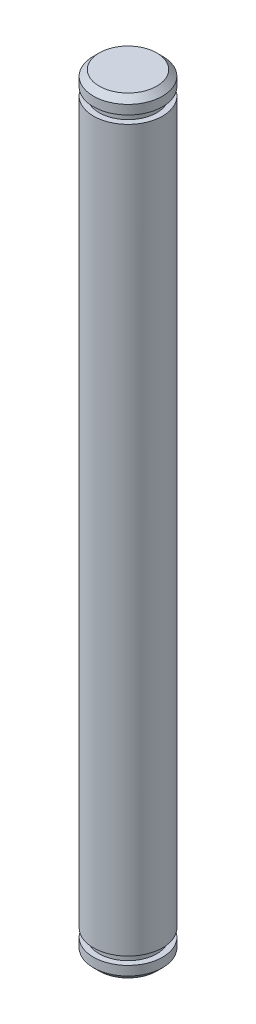
ISO-10303-21;
HEADER;
FILE_DESCRIPTION(('STEP AP214'),'2;1');
FILE_NAME('part.step','',(''),(''),'','','');
FILE_SCHEMA(('AUTOMOTIVE_DESIGN { 1 0 10303 214 1 1 1 1 }'));
ENDSEC;
DATA;
#1=APPLICATION_CONTEXT('core data for automotive mechanical design processes');
#2=APPLICATION_PROTOCOL_DEFINITION('international standard','automotive_design',2000,#1);
#3=PRODUCT_CONTEXT('',#1,'mechanical');
#4=PRODUCT('Part','Part','',(#3));
#5=PRODUCT_RELATED_PRODUCT_CATEGORY('part','',(#4));
#6=PRODUCT_DEFINITION_FORMATION('','',#4);
#7=PRODUCT_DEFINITION_CONTEXT('part definition',#1,'design');
#8=PRODUCT_DEFINITION('design','',#6,#7);
#9=PRODUCT_DEFINITION_SHAPE('','',#8);
#10=(LENGTH_UNIT() NAMED_UNIT(*) SI_UNIT(.MILLI.,.METRE.));
#11=(NAMED_UNIT(*) PLANE_ANGLE_UNIT() SI_UNIT($,.RADIAN.));
#12=(NAMED_UNIT(*) SI_UNIT($,.STERADIAN.) SOLID_ANGLE_UNIT());
#13=UNCERTAINTY_MEASURE_WITH_UNIT(LENGTH_MEASURE(1.E-05),#10,'distance_accuracy_value','');
#14=(GEOMETRIC_REPRESENTATION_CONTEXT(3) GLOBAL_UNCERTAINTY_ASSIGNED_CONTEXT((#13)) GLOBAL_UNIT_ASSIGNED_CONTEXT((#10,
#11,#12)) REPRESENTATION_CONTEXT('',''));
#15=CARTESIAN_POINT('',(0.,0.,0.));
#16=DIRECTION('',(0.,0.,1.));
#17=DIRECTION('',(1.,0.,0.));
#18=AXIS2_PLACEMENT_3D('',#15,#16,#17);
#19=CARTESIAN_POINT('',(0.,66.5,0.));
#20=DIRECTION('',(0.,-1.,0.));
#21=DIRECTION('',(0.,0.,-1.));
#22=AXIS2_PLACEMENT_3D('',#19,#20,#21);
#23=CYLINDRICAL_SURFACE('',#22,3.);
#24=CARTESIAN_POINT('',(0.,64.5,0.));
#25=DIRECTION('',(0.,1.,0.));
#26=DIRECTION('',(0.,0.,1.));
#27=AXIS2_PLACEMENT_3D('',#24,#25,#26);
#28=CIRCLE('',#27,3.);
#29=CARTESIAN_POINT('',(0.,64.5,3.));
#30=VERTEX_POINT('',#29);
#31=EDGE_CURVE('E55',#30,#30,#28,.T.);
#32=ORIENTED_EDGE('',*,*,#31,.F.);
#33=EDGE_LOOP('',(#32));
#34=FACE_BOUND('',#33,.T.);
#35=CARTESIAN_POINT('',(0.,2.,0.));
#36=DIRECTION('',(0.,-1.,0.));
#37=DIRECTION('',(0.,0.,-1.));
#38=AXIS2_PLACEMENT_3D('',#35,#36,#37);
#39=CIRCLE('',#38,3.);
#40=CARTESIAN_POINT('',(0.,2.,-3.));
#41=VERTEX_POINT('',#40);
#42=EDGE_CURVE('E67',#41,#41,#39,.T.);
#43=ORIENTED_EDGE('',*,*,#42,.F.);
#44=EDGE_LOOP('',(#43));
#45=FACE_BOUND('',#44,.T.);
#46=ADVANCED_FACE('F33',(#34,#45),#23,.T.);
#47=CARTESIAN_POINT('',(0.,66.,0.));
#48=DIRECTION('',(0.,1.,0.));
#49=DIRECTION('',(0.,0.,1.));
#50=AXIS2_PLACEMENT_3D('',#47,#48,#49);
#51=CIRCLE('',#50,3.);
#52=CARTESIAN_POINT('',(0.,66.,3.));
#53=VERTEX_POINT('',#52);
#54=EDGE_CURVE('E10',#53,#53,#51,.F.);
#55=ORIENTED_EDGE('',*,*,#54,.T.);
#56=EDGE_LOOP('',(#55));
#57=FACE_BOUND('',#56,.T.);
#58=CARTESIAN_POINT('',(0.,65.2,0.));
#59=DIRECTION('',(0.,1.,0.));
#60=DIRECTION('',(0.,0.,1.));
#61=AXIS2_PLACEMENT_3D('',#58,#59,#60);
#62=CIRCLE('',#61,3.);
#63=CARTESIAN_POINT('',(0.,65.2,3.));
#64=VERTEX_POINT('',#63);
#65=EDGE_CURVE('E54',#64,#64,#62,.T.);
#66=ORIENTED_EDGE('',*,*,#65,.T.);
#67=EDGE_LOOP('',(#66));
#68=FACE_BOUND('',#67,.T.);
#69=ADVANCED_FACE('F100',(#57,#68),#23,.T.);
#70=CARTESIAN_POINT('',(0.,66.5,0.));
#71=DIRECTION('',(0.,1.,0.));
#72=DIRECTION('',(0.,0.,1.));
#73=AXIS2_PLACEMENT_3D('',#70,#71,#72);
#74=PLANE('',#73);
#75=CARTESIAN_POINT('',(0.,66.5,0.));
#76=DIRECTION('',(0.,1.,0.));
#77=DIRECTION('',(0.,0.,1.));
#78=AXIS2_PLACEMENT_3D('',#75,#76,#77);
#79=CIRCLE('',#78,2.5);
#80=CARTESIAN_POINT('',(0.,66.5,2.5));
#81=VERTEX_POINT('',#80);
#82=EDGE_CURVE('E41',#81,#81,#79,.T.);
#83=ORIENTED_EDGE('',*,*,#82,.T.);
#84=EDGE_LOOP('',(#83));
#85=FACE_BOUND('',#84,.T.);
#86=ADVANCED_FACE('F107',(#85),#74,.T.);
#87=CARTESIAN_POINT('',(0.,65.2,0.));
#88=DIRECTION('',(0.,1.,0.));
#89=DIRECTION('',(0.,0.,1.));
#90=AXIS2_PLACEMENT_3D('',#87,#88,#89);
#91=PLANE('',#90);
#92=ORIENTED_EDGE('',*,*,#65,.F.);
#93=EDGE_LOOP('',(#92));
#94=FACE_BOUND('',#93,.T.);
#95=CARTESIAN_POINT('',(0.,65.2,0.));
#96=DIRECTION('',(0.,1.,0.));
#97=DIRECTION('',(0.,0.,1.));
#98=AXIS2_PLACEMENT_3D('',#95,#96,#97);
#99=CIRCLE('',#98,2.5);
#100=CARTESIAN_POINT('',(0.,65.2,2.5));
#101=VERTEX_POINT('',#100);
#102=EDGE_CURVE('E58',#101,#101,#99,.T.);
#103=ORIENTED_EDGE('',*,*,#102,.T.);
#104=EDGE_LOOP('',(#103));
#105=FACE_BOUND('',#104,.T.);
#106=ADVANCED_FACE('F129',(#94,#105),#91,.F.);
#107=CARTESIAN_POINT('',(0.,64.5,0.));
#108=DIRECTION('',(0.,1.,0.));
#109=DIRECTION('',(0.,0.,1.));
#110=AXIS2_PLACEMENT_3D('',#107,#108,#109);
#111=PLANE('',#110);
#112=ORIENTED_EDGE('',*,*,#31,.T.);
#113=EDGE_LOOP('',(#112));
#114=FACE_BOUND('',#113,.T.);
#115=CARTESIAN_POINT('',(0.,64.5,0.));
#116=DIRECTION('',(0.,1.,0.));
#117=DIRECTION('',(0.,0.,1.));
#118=AXIS2_PLACEMENT_3D('',#115,#116,#117);
#119=CIRCLE('',#118,2.5);
#120=CARTESIAN_POINT('',(0.,64.5,2.5));
#121=VERTEX_POINT('',#120);
#122=EDGE_CURVE('E61',#121,#121,#119,.T.);
#123=ORIENTED_EDGE('',*,*,#122,.F.);
#124=EDGE_LOOP('',(#123));
#125=FACE_BOUND('',#124,.T.);
#126=ADVANCED_FACE('F130',(#114,#125),#111,.T.);
#127=CARTESIAN_POINT('',(0.,65.2,0.));
#128=DIRECTION('',(0.,-1.,0.));
#129=DIRECTION('',(0.,0.,-1.));
#130=AXIS2_PLACEMENT_3D('',#127,#128,#129);
#131=CYLINDRICAL_SURFACE('',#130,2.5);
#132=ORIENTED_EDGE('',*,*,#102,.F.);
#133=EDGE_LOOP('',(#132));
#134=FACE_BOUND('',#133,.T.);
#135=ORIENTED_EDGE('',*,*,#122,.T.);
#136=EDGE_LOOP('',(#135));
#137=FACE_BOUND('',#136,.T.);
#138=ADVANCED_FACE('F95',(#134,#137),#131,.T.);
#139=CARTESIAN_POINT('',(0.,1.3,0.));
#140=DIRECTION('',(0.,-1.,0.));
#141=DIRECTION('',(0.,0.,-1.));
#142=AXIS2_PLACEMENT_3D('',#139,#140,#141);
#143=PLANE('',#142);
#144=CARTESIAN_POINT('',(0.,1.3,0.));
#145=DIRECTION('',(0.,-1.,0.));
#146=DIRECTION('',(0.,0.,-1.));
#147=AXIS2_PLACEMENT_3D('',#144,#145,#146);
#148=CIRCLE('',#147,3.);
#149=CARTESIAN_POINT('',(0.,1.3,-3.));
#150=VERTEX_POINT('',#149);
#151=EDGE_CURVE('E64',#150,#150,#148,.T.);
#152=ORIENTED_EDGE('',*,*,#151,.F.);
#153=EDGE_LOOP('',(#152));
#154=FACE_BOUND('',#153,.T.);
#155=CARTESIAN_POINT('',(0.,1.3,0.));
#156=DIRECTION('',(0.,-1.,0.));
#157=DIRECTION('',(0.,0.,-1.));
#158=AXIS2_PLACEMENT_3D('',#155,#156,#157);
#159=CIRCLE('',#158,2.5);
#160=CARTESIAN_POINT('',(0.,1.3,-2.5));
#161=VERTEX_POINT('',#160);
#162=EDGE_CURVE('E70',#161,#161,#159,.T.);
#163=ORIENTED_EDGE('',*,*,#162,.T.);
#164=EDGE_LOOP('',(#163));
#165=FACE_BOUND('',#164,.T.);
#166=ADVANCED_FACE('F79',(#154,#165),#143,.F.);
#167=CARTESIAN_POINT('',(0.,2.,0.));
#168=DIRECTION('',(0.,-1.,0.));
#169=DIRECTION('',(0.,0.,-1.));
#170=AXIS2_PLACEMENT_3D('',#167,#168,#169);
#171=PLANE('',#170);
#172=ORIENTED_EDGE('',*,*,#42,.T.);
#173=EDGE_LOOP('',(#172));
#174=FACE_BOUND('',#173,.T.);
#175=CARTESIAN_POINT('',(0.,2.,0.));
#176=DIRECTION('',(0.,-1.,0.));
#177=DIRECTION('',(0.,0.,-1.));
#178=AXIS2_PLACEMENT_3D('',#175,#176,#177);
#179=CIRCLE('',#178,2.5);
#180=CARTESIAN_POINT('',(0.,2.,-2.5));
#181=VERTEX_POINT('',#180);
#182=EDGE_CURVE('E73',#181,#181,#179,.T.);
#183=ORIENTED_EDGE('',*,*,#182,.F.);
#184=EDGE_LOOP('',(#183));
#185=FACE_BOUND('',#184,.T.);
#186=ADVANCED_FACE('F85',(#174,#185),#171,.T.);
#187=CARTESIAN_POINT('',(0.,1.3,0.));
#188=DIRECTION('',(0.,1.,0.));
#189=DIRECTION('',(0.,0.,1.));
#190=AXIS2_PLACEMENT_3D('',#187,#188,#189);
#191=CYLINDRICAL_SURFACE('',#190,2.5);
#192=ORIENTED_EDGE('',*,*,#162,.F.);
#193=EDGE_LOOP('',(#192));
#194=FACE_BOUND('',#193,.T.);
#195=ORIENTED_EDGE('',*,*,#182,.T.);
#196=EDGE_LOOP('',(#195));
#197=FACE_BOUND('',#196,.T.);
#198=ADVANCED_FACE('F81',(#194,#197),#191,.T.);
#199=CARTESIAN_POINT('',(0.,0.,0.));
#200=DIRECTION('',(0.,1.,0.));
#201=DIRECTION('',(0.,0.,1.));
#202=AXIS2_PLACEMENT_3D('',#199,#200,#201);
#203=PLANE('',#202);
#204=CARTESIAN_POINT('',(0.,0.,0.));
#205=DIRECTION('',(0.,1.,0.));
#206=DIRECTION('',(0.,0.,1.));
#207=AXIS2_PLACEMENT_3D('',#204,#205,#206);
#208=CIRCLE('',#207,2.5);
#209=CARTESIAN_POINT('',(0.,0.,2.5));
#210=VERTEX_POINT('',#209);
#211=EDGE_CURVE('E45',#210,#210,#208,.F.);
#212=ORIENTED_EDGE('',*,*,#211,.T.);
#213=EDGE_LOOP('',(#212));
#214=FACE_BOUND('',#213,.T.);
#215=ADVANCED_FACE('F84',(#214),#203,.F.);
#216=CARTESIAN_POINT('',(0.,0.500000000000014,0.));
#217=DIRECTION('',(0.,1.,0.));
#218=DIRECTION('',(0.,0.,1.));
#219=AXIS2_PLACEMENT_3D('',#216,#217,#218);
#220=CIRCLE('',#219,3.);
#221=CARTESIAN_POINT('',(0.,0.500000000000014,3.));
#222=VERTEX_POINT('',#221);
#223=EDGE_CURVE('E49',#222,#222,#220,.T.);
#224=ORIENTED_EDGE('',*,*,#223,.T.);
#225=EDGE_LOOP('',(#224));
#226=FACE_BOUND('',#225,.T.);
#227=ORIENTED_EDGE('',*,*,#151,.T.);
#228=EDGE_LOOP('',(#227));
#229=FACE_BOUND('',#228,.T.);
#230=ADVANCED_FACE('F103',(#226,#229),#23,.T.);
#231=CARTESIAN_POINT('',(0.,0.500000000000014,0.));
#232=DIRECTION('',(0.,1.,0.));
#233=DIRECTION('',(0.,0.,1.));
#234=AXIS2_PLACEMENT_3D('',#231,#232,#233);
#235=CONICAL_SURFACE('',#234,3.,0.785398163397439);
#236=ORIENTED_EDGE('',*,*,#211,.F.);
#237=EDGE_LOOP('',(#236));
#238=FACE_BOUND('',#237,.T.);
#239=ORIENTED_EDGE('',*,*,#223,.F.);
#240=EDGE_LOOP('',(#239));
#241=FACE_BOUND('',#240,.T.);
#242=ADVANCED_FACE('F112',(#238,#241),#235,.T.);
#243=CARTESIAN_POINT('',(0.,66.5,0.));
#244=DIRECTION('',(0.,-1.,0.));
#245=DIRECTION('',(0.,0.,-1.));
#246=AXIS2_PLACEMENT_3D('',#243,#244,#245);
#247=CONICAL_SURFACE('',#246,2.5,0.785398163397439);
#248=ORIENTED_EDGE('',*,*,#54,.F.);
#249=EDGE_LOOP('',(#248));
#250=FACE_BOUND('',#249,.T.);
#251=ORIENTED_EDGE('',*,*,#82,.F.);
#252=EDGE_LOOP('',(#251));
#253=FACE_BOUND('',#252,.T.);
#254=ADVANCED_FACE('F36',(#250,#253),#247,.T.);
#255=CLOSED_SHELL('',(#46,#69,#86,#106,#126,#138,#166,#186,#198,#215,#230,#242,#254));
#256=MANIFOLD_SOLID_BREP('B2',#255);
#257=ADVANCED_BREP_SHAPE_REPRESENTATION('',(#18,#256),#14);
#258=SHAPE_DEFINITION_REPRESENTATION(#9,#257);
ENDSEC;
END-ISO-10303-21;
